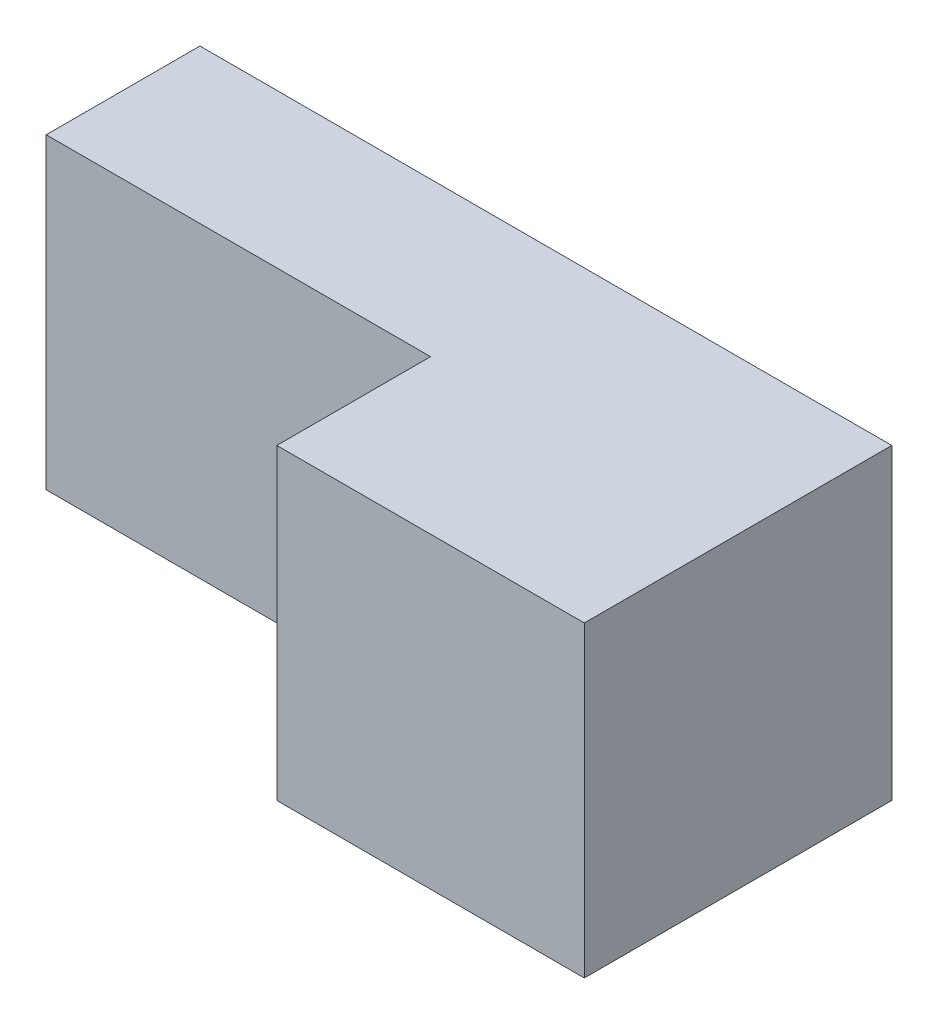
ISO-10303-21;
HEADER;
FILE_DESCRIPTION(('STEP AP214'),'2;1');
FILE_NAME('part.step','',(''),(''),'','','');
FILE_SCHEMA(('AUTOMOTIVE_DESIGN { 1 0 10303 214 1 1 1 1 }'));
ENDSEC;
DATA;
#1=APPLICATION_CONTEXT('core data for automotive mechanical design processes');
#2=APPLICATION_PROTOCOL_DEFINITION('international standard','automotive_design',2000,#1);
#3=PRODUCT_CONTEXT('',#1,'mechanical');
#4=PRODUCT('Part','Part','',(#3));
#5=PRODUCT_RELATED_PRODUCT_CATEGORY('part','',(#4));
#6=PRODUCT_DEFINITION_FORMATION('','',#4);
#7=PRODUCT_DEFINITION_CONTEXT('part definition',#1,'design');
#8=PRODUCT_DEFINITION('design','',#6,#7);
#9=PRODUCT_DEFINITION_SHAPE('','',#8);
#10=(LENGTH_UNIT() NAMED_UNIT(*) SI_UNIT(.MILLI.,.METRE.));
#11=(NAMED_UNIT(*) PLANE_ANGLE_UNIT() SI_UNIT($,.RADIAN.));
#12=(NAMED_UNIT(*) SI_UNIT($,.STERADIAN.) SOLID_ANGLE_UNIT());
#13=UNCERTAINTY_MEASURE_WITH_UNIT(LENGTH_MEASURE(1.E-05),#10,'distance_accuracy_value','');
#14=(GEOMETRIC_REPRESENTATION_CONTEXT(3) GLOBAL_UNCERTAINTY_ASSIGNED_CONTEXT((#13)) GLOBAL_UNIT_ASSIGNED_CONTEXT((#10,
#11,#12)) REPRESENTATION_CONTEXT('',''));
#15=CARTESIAN_POINT('',(0.,0.,0.));
#16=DIRECTION('',(0.,0.,1.));
#17=DIRECTION('',(1.,0.,0.));
#18=AXIS2_PLACEMENT_3D('',#15,#16,#17);
#19=CARTESIAN_POINT('',(0.,0.,25.4));
#20=DIRECTION('',(0.,0.,-1.));
#21=DIRECTION('',(-1.,0.,0.));
#22=AXIS2_PLACEMENT_3D('',#19,#20,#21);
#23=PLANE('',#22);
#24=DIRECTION('',(0.,-1.,0.));
#25=VECTOR('',#24,1.);
#26=CARTESIAN_POINT('',(63.5,50.8,25.4));
#27=LINE('',#26,#25);
#28=CARTESIAN_POINT('',(63.5,50.8,25.4));
#29=VERTEX_POINT('',#28);
#30=CARTESIAN_POINT('',(63.5,0.,25.4));
#31=VERTEX_POINT('',#30);
#32=EDGE_CURVE('E51',#29,#31,#27,.T.);
#33=ORIENTED_EDGE('',*,*,#32,.F.);
#34=DIRECTION('',(-1.,0.,0.));
#35=VECTOR('',#34,1.);
#36=CARTESIAN_POINT('',(0.,50.8,25.4));
#37=LINE('',#36,#35);
#38=CARTESIAN_POINT('',(0.,50.8,25.4));
#39=VERTEX_POINT('',#38);
#40=EDGE_CURVE('E56',#29,#39,#37,.T.);
#41=ORIENTED_EDGE('',*,*,#40,.T.);
#42=DIRECTION('',(0.,-1.,0.));
#43=VECTOR('',#42,1.);
#44=CARTESIAN_POINT('',(0.,0.,25.4));
#45=LINE('',#44,#43);
#46=CARTESIAN_POINT('',(0.,0.,25.4));
#47=VERTEX_POINT('',#46);
#48=EDGE_CURVE('E87',#39,#47,#45,.T.);
#49=ORIENTED_EDGE('',*,*,#48,.T.);
#50=DIRECTION('',(1.,0.,0.));
#51=VECTOR('',#50,1.);
#52=CARTESIAN_POINT('',(0.,0.,25.4));
#53=LINE('',#52,#51);
#54=EDGE_CURVE('E137',#47,#31,#53,.T.);
#55=ORIENTED_EDGE('',*,*,#54,.T.);
#56=EDGE_LOOP('',(#33,#41,#49,#55));
#57=FACE_BOUND('',#56,.T.);
#58=ADVANCED_FACE('F36',(#57),#23,.F.);
#59=CARTESIAN_POINT('',(0.,0.,25.4));
#60=DIRECTION('',(1.,0.,0.));
#61=DIRECTION('',(0.,0.,-1.));
#62=AXIS2_PLACEMENT_3D('',#59,#60,#61);
#63=PLANE('',#62);
#64=DIRECTION('',(0.,-1.,0.));
#65=VECTOR('',#64,1.);
#66=CARTESIAN_POINT('',(0.,0.,0.));
#67=LINE('',#66,#65);
#68=CARTESIAN_POINT('',(0.,50.8,0.));
#69=VERTEX_POINT('',#68);
#70=CARTESIAN_POINT('',(0.,0.,0.));
#71=VERTEX_POINT('',#70);
#72=EDGE_CURVE('E93',#69,#71,#67,.T.);
#73=ORIENTED_EDGE('',*,*,#72,.T.);
#74=DIRECTION('',(0.,0.,-1.));
#75=VECTOR('',#74,1.);
#76=CARTESIAN_POINT('',(0.,0.,25.4));
#77=LINE('',#76,#75);
#78=EDGE_CURVE('E11',#47,#71,#77,.T.);
#79=ORIENTED_EDGE('',*,*,#78,.F.);
#80=ORIENTED_EDGE('',*,*,#48,.F.);
#81=DIRECTION('',(0.,0.,-1.));
#82=VECTOR('',#81,1.);
#83=CARTESIAN_POINT('',(0.,50.8,25.4));
#84=LINE('',#83,#82);
#85=EDGE_CURVE('E79',#39,#69,#84,.T.);
#86=ORIENTED_EDGE('',*,*,#85,.T.);
#87=EDGE_LOOP('',(#73,#79,#80,#86));
#88=FACE_BOUND('',#87,.T.);
#89=ADVANCED_FACE('F38',(#88),#63,.F.);
#90=CARTESIAN_POINT('',(0.,0.,25.4));
#91=DIRECTION('',(0.,1.,0.));
#92=DIRECTION('',(0.,0.,1.));
#93=AXIS2_PLACEMENT_3D('',#90,#91,#92);
#94=PLANE('',#93);
#95=DIRECTION('',(1.,0.,0.));
#96=VECTOR('',#95,1.);
#97=CARTESIAN_POINT('',(0.,0.,0.));
#98=LINE('',#97,#96);
#99=CARTESIAN_POINT('',(114.3,0.,0.));
#100=VERTEX_POINT('',#99);
#101=EDGE_CURVE('E96',#71,#100,#98,.T.);
#102=ORIENTED_EDGE('',*,*,#101,.T.);
#103=DIRECTION('',(0.,0.,-1.));
#104=VECTOR('',#103,1.);
#105=CARTESIAN_POINT('',(114.3,0.,25.4));
#106=LINE('',#105,#104);
#107=CARTESIAN_POINT('',(114.3,0.,50.8));
#108=VERTEX_POINT('',#107);
#109=EDGE_CURVE('E44',#108,#100,#106,.T.);
#110=ORIENTED_EDGE('',*,*,#109,.F.);
#111=DIRECTION('',(1.,0.,0.));
#112=VECTOR('',#111,1.);
#113=CARTESIAN_POINT('',(114.3,0.,50.8));
#114=LINE('',#113,#112);
#115=CARTESIAN_POINT('',(63.5,0.,50.8));
#116=VERTEX_POINT('',#115);
#117=EDGE_CURVE('E120',#116,#108,#114,.T.);
#118=ORIENTED_EDGE('',*,*,#117,.F.);
#119=DIRECTION('',(0.,0.,-1.));
#120=VECTOR('',#119,1.);
#121=CARTESIAN_POINT('',(63.5,0.,50.8));
#122=LINE('',#121,#120);
#123=EDGE_CURVE('E101',#116,#31,#122,.T.);
#124=ORIENTED_EDGE('',*,*,#123,.T.);
#125=ORIENTED_EDGE('',*,*,#54,.F.);
#126=ORIENTED_EDGE('',*,*,#78,.T.);
#127=EDGE_LOOP('',(#102,#110,#118,#124,#125,#126));
#128=FACE_BOUND('',#127,.T.);
#129=ADVANCED_FACE('F117',(#128),#94,.F.);
#130=CARTESIAN_POINT('',(114.3,0.,25.4));
#131=DIRECTION('',(-1.,0.,0.));
#132=DIRECTION('',(0.,0.,1.));
#133=AXIS2_PLACEMENT_3D('',#130,#131,#132);
#134=PLANE('',#133);
#135=DIRECTION('',(0.,1.,0.));
#136=VECTOR('',#135,1.);
#137=CARTESIAN_POINT('',(114.3,0.,0.));
#138=LINE('',#137,#136);
#139=CARTESIAN_POINT('',(114.3,50.8,0.));
#140=VERTEX_POINT('',#139);
#141=EDGE_CURVE('E88',#100,#140,#138,.T.);
#142=ORIENTED_EDGE('',*,*,#141,.T.);
#143=DIRECTION('',(0.,0.,-1.));
#144=VECTOR('',#143,1.);
#145=CARTESIAN_POINT('',(114.3,50.8,25.4));
#146=LINE('',#145,#144);
#147=CARTESIAN_POINT('',(114.3,50.8,50.8));
#148=VERTEX_POINT('',#147);
#149=EDGE_CURVE('E83',#148,#140,#146,.T.);
#150=ORIENTED_EDGE('',*,*,#149,.F.);
#151=DIRECTION('',(0.,1.,0.));
#152=VECTOR('',#151,1.);
#153=CARTESIAN_POINT('',(114.3,50.8,50.8));
#154=LINE('',#153,#152);
#155=EDGE_CURVE('E113',#108,#148,#154,.T.);
#156=ORIENTED_EDGE('',*,*,#155,.F.);
#157=ORIENTED_EDGE('',*,*,#109,.T.);
#158=EDGE_LOOP('',(#142,#150,#156,#157));
#159=FACE_BOUND('',#158,.T.);
#160=ADVANCED_FACE('F111',(#159),#134,.F.);
#161=CARTESIAN_POINT('',(0.,50.8,25.4));
#162=DIRECTION('',(0.,-1.,0.));
#163=DIRECTION('',(0.,0.,-1.));
#164=AXIS2_PLACEMENT_3D('',#161,#162,#163);
#165=PLANE('',#164);
#166=DIRECTION('',(-1.,0.,0.));
#167=VECTOR('',#166,1.);
#168=CARTESIAN_POINT('',(0.,50.8,0.));
#169=LINE('',#168,#167);
#170=EDGE_CURVE('E76',#140,#69,#169,.T.);
#171=ORIENTED_EDGE('',*,*,#170,.T.);
#172=ORIENTED_EDGE('',*,*,#85,.F.);
#173=ORIENTED_EDGE('',*,*,#40,.F.);
#174=DIRECTION('',(0.,0.,-1.));
#175=VECTOR('',#174,1.);
#176=CARTESIAN_POINT('',(63.5,50.8,50.8));
#177=LINE('',#176,#175);
#178=CARTESIAN_POINT('',(63.5,50.8,50.8));
#179=VERTEX_POINT('',#178);
#180=EDGE_CURVE('E97',#179,#29,#177,.T.);
#181=ORIENTED_EDGE('',*,*,#180,.F.);
#182=DIRECTION('',(-1.,0.,0.));
#183=VECTOR('',#182,1.);
#184=CARTESIAN_POINT('',(114.3,50.8,50.8));
#185=LINE('',#184,#183);
#186=EDGE_CURVE('E132',#148,#179,#185,.T.);
#187=ORIENTED_EDGE('',*,*,#186,.F.);
#188=ORIENTED_EDGE('',*,*,#149,.T.);
#189=EDGE_LOOP('',(#171,#172,#173,#181,#187,#188));
#190=FACE_BOUND('',#189,.T.);
#191=ADVANCED_FACE('F78',(#190),#165,.F.);
#192=CARTESIAN_POINT('',(0.,0.,0.));
#193=DIRECTION('',(0.,0.,-1.));
#194=DIRECTION('',(-1.,0.,0.));
#195=AXIS2_PLACEMENT_3D('',#192,#193,#194);
#196=PLANE('',#195);
#197=ORIENTED_EDGE('',*,*,#72,.F.);
#198=ORIENTED_EDGE('',*,*,#170,.F.);
#199=ORIENTED_EDGE('',*,*,#141,.F.);
#200=ORIENTED_EDGE('',*,*,#101,.F.);
#201=EDGE_LOOP('',(#197,#198,#199,#200));
#202=FACE_BOUND('',#201,.T.);
#203=ADVANCED_FACE('F95',(#202),#196,.T.);
#204=CARTESIAN_POINT('',(63.5,50.8,50.8));
#205=DIRECTION('',(1.,0.,0.));
#206=DIRECTION('',(0.,0.,-1.));
#207=AXIS2_PLACEMENT_3D('',#204,#205,#206);
#208=PLANE('',#207);
#209=ORIENTED_EDGE('',*,*,#32,.T.);
#210=ORIENTED_EDGE('',*,*,#123,.F.);
#211=DIRECTION('',(0.,-1.,0.));
#212=VECTOR('',#211,1.);
#213=CARTESIAN_POINT('',(63.5,50.8,50.8));
#214=LINE('',#213,#212);
#215=EDGE_CURVE('E128',#179,#116,#214,.T.);
#216=ORIENTED_EDGE('',*,*,#215,.F.);
#217=ORIENTED_EDGE('',*,*,#180,.T.);
#218=EDGE_LOOP('',(#209,#210,#216,#217));
#219=FACE_BOUND('',#218,.T.);
#220=ADVANCED_FACE('F140',(#219),#208,.F.);
#221=CARTESIAN_POINT('',(0.,0.,50.8));
#222=DIRECTION('',(0.,0.,-1.));
#223=DIRECTION('',(-1.,0.,0.));
#224=AXIS2_PLACEMENT_3D('',#221,#222,#223);
#225=PLANE('',#224);
#226=ORIENTED_EDGE('',*,*,#155,.T.);
#227=ORIENTED_EDGE('',*,*,#186,.T.);
#228=ORIENTED_EDGE('',*,*,#215,.T.);
#229=ORIENTED_EDGE('',*,*,#117,.T.);
#230=EDGE_LOOP('',(#226,#227,#228,#229));
#231=FACE_BOUND('',#230,.T.);
#232=ADVANCED_FACE('F124',(#231),#225,.F.);
#233=CLOSED_SHELL('',(#58,#89,#129,#160,#191,#203,#220,#232));
#234=MANIFOLD_SOLID_BREP('B2',#233);
#235=ADVANCED_BREP_SHAPE_REPRESENTATION('',(#18,#234),#14);
#236=SHAPE_DEFINITION_REPRESENTATION(#9,#235);
ENDSEC;
END-ISO-10303-21;
